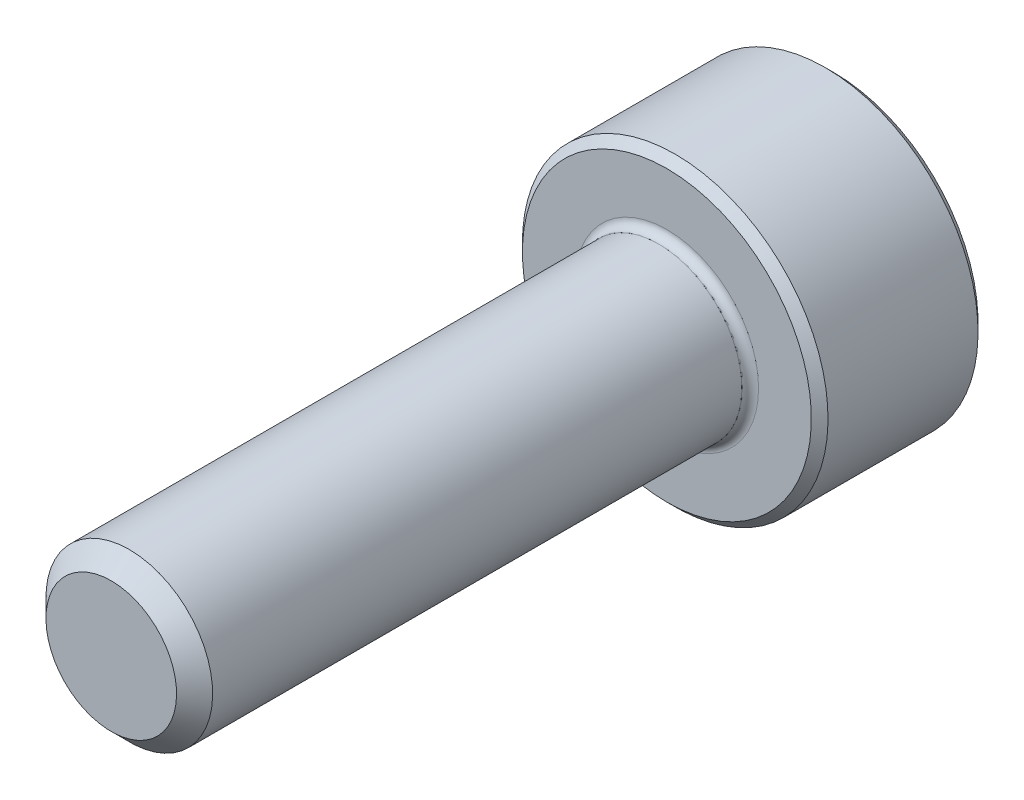
ISO-10303-21;
HEADER;
FILE_DESCRIPTION(('STEP AP214'),'2;1');
FILE_NAME('part.step','',(''),(''),'','','');
FILE_SCHEMA(('AUTOMOTIVE_DESIGN { 1 0 10303 214 1 1 1 1 }'));
ENDSEC;
DATA;
#1=APPLICATION_CONTEXT('core data for automotive mechanical design processes');
#2=APPLICATION_PROTOCOL_DEFINITION('international standard','automotive_design',2000,#1);
#3=PRODUCT_CONTEXT('',#1,'mechanical');
#4=PRODUCT('Part','Part','',(#3));
#5=PRODUCT_RELATED_PRODUCT_CATEGORY('part','',(#4));
#6=PRODUCT_DEFINITION_FORMATION('','',#4);
#7=PRODUCT_DEFINITION_CONTEXT('part definition',#1,'design');
#8=PRODUCT_DEFINITION('design','',#6,#7);
#9=PRODUCT_DEFINITION_SHAPE('','',#8);
#10=(LENGTH_UNIT() NAMED_UNIT(*) SI_UNIT(.MILLI.,.METRE.));
#11=(NAMED_UNIT(*) PLANE_ANGLE_UNIT() SI_UNIT($,.RADIAN.));
#12=(NAMED_UNIT(*) SI_UNIT($,.STERADIAN.) SOLID_ANGLE_UNIT());
#13=UNCERTAINTY_MEASURE_WITH_UNIT(LENGTH_MEASURE(1.E-05),#10,'distance_accuracy_value','');
#14=(GEOMETRIC_REPRESENTATION_CONTEXT(3) GLOBAL_UNCERTAINTY_ASSIGNED_CONTEXT((#13)) GLOBAL_UNIT_ASSIGNED_CONTEXT((#10,
#11,#12)) REPRESENTATION_CONTEXT('',''));
#15=CARTESIAN_POINT('',(0.,0.,0.));
#16=DIRECTION('',(0.,0.,1.));
#17=DIRECTION('',(1.,0.,0.));
#18=AXIS2_PLACEMENT_3D('',#15,#16,#17);
#19=CARTESIAN_POINT('',(0.,0.,-3.5));
#20=DIRECTION('',(0.,0.,-1.));
#21=DIRECTION('',(0.,-1.,0.));
#22=AXIS2_PLACEMENT_3D('',#19,#20,#21);
#23=PLANE('',#22);
#24=CARTESIAN_POINT('',(0.,0.,-3.5));
#25=DIRECTION('',(0.,0.,-1.));
#26=DIRECTION('',(0.,1.,0.));
#27=AXIS2_PLACEMENT_3D('',#24,#25,#26);
#28=CIRCLE('',#27,1.5);
#29=CARTESIAN_POINT('',(0.,1.5,-3.5));
#30=VERTEX_POINT('',#29);
#31=EDGE_CURVE('E12',#30,#30,#28,.T.);
#32=ORIENTED_EDGE('',*,*,#31,.T.);
#33=EDGE_LOOP('',(#32));
#34=FACE_BOUND('',#33,.T.);
#35=ADVANCED_FACE('F47',(#34),#23,.T.);
#36=CARTESIAN_POINT('',(0.,0.,-2.48397459621555));
#37=DIRECTION('',(0.,0.,1.));
#38=DIRECTION('',(0.,1.,0.));
#39=AXIS2_PLACEMENT_3D('',#36,#37,#38);
#40=CYLINDRICAL_SURFACE('',#39,1.5);
#41=ORIENTED_EDGE('',*,*,#31,.F.);
#42=EDGE_LOOP('',(#41));
#43=FACE_BOUND('',#42,.T.);
#44=CARTESIAN_POINT('',(0.,0.,-3.35));
#45=DIRECTION('',(0.,0.,-1.));
#46=DIRECTION('',(0.,1.,0.));
#47=AXIS2_PLACEMENT_3D('',#44,#45,#46);
#48=CIRCLE('',#47,1.5);
#49=CARTESIAN_POINT('',(0.,1.5,-3.35));
#50=VERTEX_POINT('',#49);
#51=EDGE_CURVE('E53',#50,#50,#48,.T.);
#52=ORIENTED_EDGE('',*,*,#51,.T.);
#53=EDGE_LOOP('',(#52));
#54=FACE_BOUND('',#53,.T.);
#55=ADVANCED_FACE('F58',(#43,#54),#40,.T.);
#56=CARTESIAN_POINT('',(0.,0.,-2.48397459621555));
#57=DIRECTION('',(0.,0.,-1.));
#58=DIRECTION('',(0.,-1.,0.));
#59=AXIS2_PLACEMENT_3D('',#56,#57,#58);
#60=CONICAL_SURFACE('',#59,0.,1.04719755119659);
#61=ORIENTED_EDGE('',*,*,#51,.F.);
#62=EDGE_LOOP('',(#61));
#63=FACE_BOUND('',#62,.T.);
#64=CARTESIAN_POINT('',(0.,0.,-2.48397459621555));
#65=VERTEX_POINT('',#64);
#66=VERTEX_LOOP('',#65);
#67=FACE_BOUND('',#66,.T.);
#68=ADVANCED_FACE('F56',(#63,#67),#60,.T.);
#69=CLOSED_SHELL('',(#35,#55,#68));
#70=MANIFOLD_SOLID_BREP('B2',#69);
#71=CARTESIAN_POINT('',(-2.76,-2.75,-3.35));
#72=DIRECTION('',(0.,0.,1.));
#73=DIRECTION('',(-1.,0.,0.));
#74=AXIS2_PLACEMENT_3D('',#71,#72,#73);
#75=PLANE('',#74);
#76=CARTESIAN_POINT('',(0.,0.,-3.35));
#77=DIRECTION('',(0.,0.,-1.));
#78=DIRECTION('',(0.,1.,0.));
#79=AXIS2_PLACEMENT_3D('',#76,#77,#78);
#80=CIRCLE('',#79,1.5);
#81=CARTESIAN_POINT('',(0.,1.5,-3.35));
#82=VERTEX_POINT('',#81);
#83=EDGE_CURVE('E106',#82,#82,#80,.T.);
#84=ORIENTED_EDGE('',*,*,#83,.F.);
#85=EDGE_LOOP('',(#84));
#86=FACE_BOUND('',#85,.T.);
#87=ADVANCED_FACE('F103',(#86),#75,.T.);
#88=CARTESIAN_POINT('',(0.,0.,-3.35));
#89=DIRECTION('',(0.,0.,1.));
#90=DIRECTION('',(0.,1.,0.));
#91=AXIS2_PLACEMENT_3D('',#88,#89,#90);
#92=TOROIDAL_SURFACE('',#91,1.65,0.15);
#93=CARTESIAN_POINT('',(0.,0.,-3.5));
#94=DIRECTION('',(0.,0.,-1.));
#95=DIRECTION('',(0.,1.,0.));
#96=AXIS2_PLACEMENT_3D('',#93,#94,#95);
#97=CIRCLE('',#96,1.65);
#98=CARTESIAN_POINT('',(0.,1.65,-3.5));
#99=VERTEX_POINT('',#98);
#100=EDGE_CURVE('E181',#99,#99,#97,.T.);
#101=ORIENTED_EDGE('',*,*,#100,.F.);
#102=EDGE_LOOP('',(#101));
#103=FACE_BOUND('',#102,.T.);
#104=ORIENTED_EDGE('',*,*,#83,.T.);
#105=EDGE_LOOP('',(#104));
#106=FACE_BOUND('',#105,.T.);
#107=ADVANCED_FACE('F281',(#103,#106),#92,.F.);
#108=CARTESIAN_POINT('',(0.,2.6,-3.5));
#109=DIRECTION('',(0.,0.,1.));
#110=DIRECTION('',(0.,1.,0.));
#111=AXIS2_PLACEMENT_3D('',#108,#109,#110);
#112=PLANE('',#111);
#113=CARTESIAN_POINT('',(0.,0.,-3.5));
#114=DIRECTION('',(0.,0.,-1.));
#115=DIRECTION('',(0.,1.,0.));
#116=AXIS2_PLACEMENT_3D('',#113,#114,#115);
#117=CIRCLE('',#116,2.6);
#118=CARTESIAN_POINT('',(0.,2.6,-3.5));
#119=VERTEX_POINT('',#118);
#120=EDGE_CURVE('E184',#119,#119,#117,.T.);
#121=ORIENTED_EDGE('',*,*,#120,.F.);
#122=EDGE_LOOP('',(#121));
#123=FACE_BOUND('',#122,.T.);
#124=ORIENTED_EDGE('',*,*,#100,.T.);
#125=EDGE_LOOP('',(#124));
#126=FACE_BOUND('',#125,.T.);
#127=ADVANCED_FACE('F278',(#123,#126),#112,.T.);
#128=CARTESIAN_POINT('',(0.,0.,-3.5));
#129=DIRECTION('',(0.,0.,-1.));
#130=DIRECTION('',(0.,-1.,0.));
#131=AXIS2_PLACEMENT_3D('',#128,#129,#130);
#132=CONICAL_SURFACE('',#131,2.6,0.785398163397445);
#133=CARTESIAN_POINT('',(0.,0.,-3.65));
#134=DIRECTION('',(0.,0.,-1.));
#135=DIRECTION('',(0.,1.,0.));
#136=AXIS2_PLACEMENT_3D('',#133,#134,#135);
#137=CIRCLE('',#136,2.75);
#138=CARTESIAN_POINT('',(0.,2.75,-3.65));
#139=VERTEX_POINT('',#138);
#140=EDGE_CURVE('E271',#139,#139,#137,.T.);
#141=ORIENTED_EDGE('',*,*,#140,.F.);
#142=EDGE_LOOP('',(#141));
#143=FACE_BOUND('',#142,.T.);
#144=ORIENTED_EDGE('',*,*,#120,.T.);
#145=EDGE_LOOP('',(#144));
#146=FACE_BOUND('',#145,.T.);
#147=ADVANCED_FACE('F276',(#143,#146),#132,.T.);
#148=CARTESIAN_POINT('',(0.,0.,6.5));
#149=DIRECTION('',(0.,0.,1.));
#150=DIRECTION('',(0.,1.,0.));
#151=AXIS2_PLACEMENT_3D('',#148,#149,#150);
#152=CYLINDRICAL_SURFACE('',#151,2.75);
#153=CARTESIAN_POINT('',(0.,0.,-6.35));
#154=DIRECTION('',(0.,0.,-1.));
#155=DIRECTION('',(0.,1.,0.));
#156=AXIS2_PLACEMENT_3D('',#153,#154,#155);
#157=CIRCLE('',#156,2.75);
#158=CARTESIAN_POINT('',(0.,2.75,-6.35));
#159=VERTEX_POINT('',#158);
#160=EDGE_CURVE('E268',#159,#159,#157,.T.);
#161=ORIENTED_EDGE('',*,*,#160,.F.);
#162=EDGE_LOOP('',(#161));
#163=FACE_BOUND('',#162,.T.);
#164=ORIENTED_EDGE('',*,*,#140,.T.);
#165=EDGE_LOOP('',(#164));
#166=FACE_BOUND('',#165,.T.);
#167=ADVANCED_FACE('F307',(#163,#166),#152,.T.);
#168=CARTESIAN_POINT('',(0.,0.,-6.35));
#169=DIRECTION('',(0.,0.,1.));
#170=DIRECTION('',(0.,1.,0.));
#171=AXIS2_PLACEMENT_3D('',#168,#169,#170);
#172=CONICAL_SURFACE('',#171,2.75,0.785398163397451);
#173=CARTESIAN_POINT('',(0.,0.,-6.5));
#174=DIRECTION('',(0.,0.,-1.));
#175=DIRECTION('',(0.,1.,0.));
#176=AXIS2_PLACEMENT_3D('',#173,#174,#175);
#177=CIRCLE('',#176,2.6);
#178=CARTESIAN_POINT('',(0.,2.6,-6.5));
#179=VERTEX_POINT('',#178);
#180=EDGE_CURVE('E167',#179,#179,#177,.T.);
#181=ORIENTED_EDGE('',*,*,#180,.F.);
#182=EDGE_LOOP('',(#181));
#183=FACE_BOUND('',#182,.T.);
#184=ORIENTED_EDGE('',*,*,#160,.T.);
#185=EDGE_LOOP('',(#184));
#186=FACE_BOUND('',#185,.T.);
#187=ADVANCED_FACE('F315',(#183,#186),#172,.T.);
#188=CARTESIAN_POINT('',(0.,0.,-6.5));
#189=DIRECTION('',(0.,0.,-1.));
#190=DIRECTION('',(0.,-1.,0.));
#191=AXIS2_PLACEMENT_3D('',#188,#189,#190);
#192=PLANE('',#191);
#193=CARTESIAN_POINT('',(0.,0.,-6.5));
#194=DIRECTION('',(0.,0.,1.));
#195=DIRECTION('',(1.,0.,0.));
#196=AXIS2_PLACEMENT_3D('',#193,#194,#195);
#197=CIRCLE('',#196,1.55162884844712);
#198=CARTESIAN_POINT('',(1.55162884844712,0.,-6.5));
#199=VERTEX_POINT('',#198);
#200=EDGE_CURVE('E45',#199,#199,#197,.T.);
#201=ORIENTED_EDGE('',*,*,#200,.T.);
#202=EDGE_LOOP('',(#201));
#203=FACE_BOUND('',#202,.T.);
#204=ORIENTED_EDGE('',*,*,#180,.T.);
#205=EDGE_LOOP('',(#204));
#206=FACE_BOUND('',#205,.T.);
#207=ADVANCED_FACE('F323',(#203,#206),#192,.T.);
#208=CARTESIAN_POINT('',(0.,0.,-6.5));
#209=DIRECTION('',(0.,0.,-1.));
#210=DIRECTION('',(1.,0.,0.));
#211=AXIS2_PLACEMENT_3D('',#208,#209,#210);
#212=CONICAL_SURFACE('',#211,1.55162884844712,0.78539816339745);
#213=ORIENTED_EDGE('',*,*,#200,.F.);
#214=EDGE_LOOP('',(#213));
#215=FACE_BOUND('',#214,.T.);
#216=CARTESIAN_POINT('',(-0.000199999999999347,-1.4434911430279,-6.39186230843608));
#217=CARTESIAN_POINT('',(0.0427751670715874,-1.41867941875065,-6.36706849258205));
#218=CARTESIAN_POINT('',(0.0864690047459488,-1.39345276980743,-6.34373055894563));
#219=CARTESIAN_POINT('',(0.175565930841943,-1.34201263554194,-6.30099882861148));
#220=CARTESIAN_POINT('',(0.220977498357065,-1.31579425481276,-6.28162881688736));
#221=CARTESIAN_POINT('',(0.312547820935261,-1.26292610442246,-6.24844730794042));
#222=CARTESIAN_POINT('',(0.358683240175886,-1.23628980770471,-6.2345523835796));
#223=CARTESIAN_POINT('',(0.451970080407593,-1.18243062538508,-6.21314410668758));
#224=CARTESIAN_POINT('',(0.499118649136381,-1.15520938653761,-6.20561476609373));
#225=CARTESIAN_POINT('',(0.580373556887253,-1.10829684367467,-6.19882132257765));
#226=CARTESIAN_POINT('',(0.614374876627942,-1.08866617256958,-6.1978153836313));
#227=CARTESIAN_POINT('',(0.682317764432479,-1.04943932800611,-6.19950823943826));
#228=CARTESIAN_POINT('',(0.716259317655659,-1.02984316311599,-6.20220785174248));
#229=CARTESIAN_POINT('',(0.783814856457501,-0.990839954603499,-6.21115575484332));
#230=CARTESIAN_POINT('',(0.817428507286776,-0.971433104248771,-6.21740735042665));
#231=CARTESIAN_POINT('',(0.884094638217814,-0.932943395609905,-6.23312250594085));
#232=CARTESIAN_POINT('',(0.917146871030297,-0.9138606800983,-6.2425874446144));
#233=CARTESIAN_POINT('',(1.00179969160027,-0.864986351354567,-6.27067821521453));
#234=CARTESIAN_POINT('',(1.05286649242964,-0.835502920149075,-6.29141698197915));
#235=CARTESIAN_POINT('',(1.15300085411326,-0.777690319475908,-6.33813395919842));
#236=CARTESIAN_POINT('',(1.20207431157827,-0.749357745598417,-6.36409512047371));
#237=CARTESIAN_POINT('',(1.2502,-0.721572366433194,-6.39186230843608));
#238=B_SPLINE_CURVE_WITH_KNOTS('',3,(#216,#217,#218,#219,#220,#221,#222,#223,#224,#225,#226,
#227,#228,#229,#230,#231,#232,#233,#234,#235,#236,#237),.UNSPECIFIED.,.F.,.F.,(4,2,2,2,2,2,2,2,
2,2,4),(0.,0.166533409618304,0.334037607289762,0.498880396489698,0.663307919240275,
0.780963963458827,0.898645970148454,1.01643764860773,1.1342799317155,1.32148652032141,
1.50809158792573),.UNSPECIFIED.);
#239=CARTESIAN_POINT('',(0.,-1.44337567297406,-6.39174682452695));
#240=VERTEX_POINT('',#239);
#241=CARTESIAN_POINT('',(1.25,-0.721687836487032,-6.39174682452694));
#242=VERTEX_POINT('',#241);
#243=EDGE_CURVE('E161',#240,#242,#238,.T.);
#244=ORIENTED_EDGE('',*,*,#243,.T.);
#245=CARTESIAN_POINT('',(1.25,-1.52022146239345,-6.91651070319084));
#246=CARTESIAN_POINT('',(1.25,-1.48354689134962,-6.88818689718723));
#247=CARTESIAN_POINT('',(1.25,-1.44667707589305,-6.86011672093047));
#248=CARTESIAN_POINT('',(1.25,-1.37246477804769,-6.80459065501776));
#249=CARTESIAN_POINT('',(1.25,-1.33512218721453,-6.77713491044787));
#250=CARTESIAN_POINT('',(1.25,-1.22171630832114,-6.69545809771049));
#251=CARTESIAN_POINT('',(1.25,-1.14482995781092,-6.6423614251193));
#252=CARTESIAN_POINT('',(1.25,-0.983056768942587,-6.53734973416941));
#253=CARTESIAN_POINT('',(1.25,-0.897974111811057,-6.48573326925832));
#254=CARTESIAN_POINT('',(1.25,-0.723462355215556,-6.39078355108508));
#255=CARTESIAN_POINT('',(1.25,-0.634049271919706,-6.34742232185916));
#256=CARTESIAN_POINT('',(1.25,-0.500588771143699,-6.29435177040724));
#257=CARTESIAN_POINT('',(1.25,-0.45869172620811,-6.27926501327173));
#258=CARTESIAN_POINT('',(1.25,-0.373815329706778,-6.25244749770266));
#259=CARTESIAN_POINT('',(1.25,-0.330835910419723,-6.24071694982871));
#260=CARTESIAN_POINT('',(1.25,-0.244810833071148,-6.22144313304601));
#261=CARTESIAN_POINT('',(1.25,-0.20178270746757,-6.21382289169453));
#262=CARTESIAN_POINT('',(1.25,-0.115176247984995,-6.20293190707962));
#263=CARTESIAN_POINT('',(1.25,-0.0715980347745598,-6.1996602260857));
#264=CARTESIAN_POINT('',(1.25,0.0136806197531965,-6.19775210045869));
#265=CARTESIAN_POINT('',(1.25,0.0553765370047047,-6.19891205716704));
#266=CARTESIAN_POINT('',(1.25,0.13844909645316,-6.20533266388464));
#267=CARTESIAN_POINT('',(1.25,0.179825709781942,-6.21059368038276));
#268=CARTESIAN_POINT('',(1.25,0.262662840763599,-6.22500574721218));
#269=CARTESIAN_POINT('',(1.25,0.304111120669651,-6.23422600730023));
#270=CARTESIAN_POINT('',(1.25,0.386089884230835,-6.25604235623938));
#271=CARTESIAN_POINT('',(1.25,0.426620414510369,-6.26863827317792));
#272=CARTESIAN_POINT('',(1.25,0.550794781768362,-6.31205959164791));
#273=CARTESIAN_POINT('',(1.25,0.632755591043412,-6.34768282700966));
#274=CARTESIAN_POINT('',(1.25,0.792852508946383,-6.42696814455953));
#275=CARTESIAN_POINT('',(1.25,0.870973935410876,-6.47065844211049));
#276=CARTESIAN_POINT('',(1.25,1.02031328199646,-6.56088158787621));
#277=CARTESIAN_POINT('',(1.25,1.09168171050215,-6.60716845879521));
#278=CARTESIAN_POINT('',(1.25,1.19682802849918,-6.67876149953674));
#279=CARTESIAN_POINT('',(1.25,1.2314248214359,-6.70288582787532));
#280=CARTESIAN_POINT('',(1.25,1.30014350643268,-6.75178258410313));
#281=CARTESIAN_POINT('',(1.25,1.33426552680451,-6.7765548314612));
#282=CARTESIAN_POINT('',(1.25,1.36818950249276,-6.8015960474388));
#283=B_SPLINE_CURVE_WITH_KNOTS('',3,(#245,#246,#247,#248,#249,#250,#251,#252,#253,#254,#255,
#256,#257,#258,#259,#260,#261,#262,#263,#264,#265,#266,#267,#268,#269,#270,#271,#272,#273,#274,
#275,#276,#277,#278,#279,#280,#281,#282),.UNSPECIFIED.,.F.,.F.,(4,2,2,2,2,2,2,2,2,2,2,2,2,2,2,2,
2,2,4),(0.,0.139012369615044,0.278057225136918,0.558259504053771,0.856585057342474,
1.15388088887299,1.28736138903992,1.42085026158167,1.55174393609413,1.68260937990424,
1.80753647715252,1.93247473971975,2.05969207441603,2.18690293152764,2.45422704655832,
2.72250450232039,2.97756898823762,3.10409578574714,3.23058769667827),.UNSPECIFIED.);
#284=CARTESIAN_POINT('',(1.25,0.721687836487032,-6.39174682452694));
#285=VERTEX_POINT('',#284);
#286=EDGE_CURVE('E170',#242,#285,#283,.T.);
#287=ORIENTED_EDGE('',*,*,#286,.T.);
#288=CARTESIAN_POINT('',(1.2502,0.721572366433194,-6.39186230843608));
#289=CARTESIAN_POINT('',(1.20722483292841,0.746384090710444,-6.36706849258205));
#290=CARTESIAN_POINT('',(1.16353099525405,0.771610739653664,-6.34373055894563));
#291=CARTESIAN_POINT('',(1.07443406915806,0.823050873919154,-6.30099882861148));
#292=CARTESIAN_POINT('',(1.02902250164294,0.849269254648333,-6.28162881688736));
#293=CARTESIAN_POINT('',(0.93745217906474,0.902137405038635,-6.24844730794042));
#294=CARTESIAN_POINT('',(0.891316759824114,0.928773701756387,-6.2345523835796));
#295=CARTESIAN_POINT('',(0.798029919592408,0.982632884076012,-6.21314410668758));
#296=CARTESIAN_POINT('',(0.750881350863621,1.00985412292348,-6.20561476609373));
#297=CARTESIAN_POINT('',(0.669626443112748,1.05676666578643,-6.19882132257765));
#298=CARTESIAN_POINT('',(0.635625123372059,1.07639733689152,-6.19781538363129));
#299=CARTESIAN_POINT('',(0.567682235567523,1.11562418145499,-6.19950823943826));
#300=CARTESIAN_POINT('',(0.533740682344343,1.1352203463451,-6.20220785174248));
#301=CARTESIAN_POINT('',(0.466185143542501,1.1742235548576,-6.21115575484332));
#302=CARTESIAN_POINT('',(0.432571492713226,1.19363040521233,-6.21740735042665));
#303=CARTESIAN_POINT('',(0.365905361782187,1.23212011385119,-6.23312250594085));
#304=CARTESIAN_POINT('',(0.332853128969705,1.2512028293628,-6.2425874446144));
#305=CARTESIAN_POINT('',(0.248200308399736,1.30007715810653,-6.27067821521453));
#306=CARTESIAN_POINT('',(0.197133507570362,1.32956058931202,-6.29141698197915));
#307=CARTESIAN_POINT('',(0.0969991458867456,1.38737318998519,-6.33813395919842));
#308=CARTESIAN_POINT('',(0.0479256884217306,1.41570576386268,-6.36409512047371));
#309=CARTESIAN_POINT('',(-0.000200000000000208,1.4434911430279,-6.39186230843608));
#310=B_SPLINE_CURVE_WITH_KNOTS('',3,(#288,#289,#290,#291,#292,#293,#294,#295,#296,#297,#298,
#299,#300,#301,#302,#303,#304,#305,#306,#307,#308,#309),.UNSPECIFIED.,.F.,.F.,(4,2,2,2,2,2,2,2,
2,2,4),(0.,0.166533409618303,0.334037607289761,0.498880396489698,0.663307919240274,
0.780963963458826,0.898645970148452,1.01643764860773,1.13427993171549,1.32148652032141,
1.50809158792574),.UNSPECIFIED.);
#311=CARTESIAN_POINT('',(0.,1.44337567297406,-6.39174682452694));
#312=VERTEX_POINT('',#311);
#313=EDGE_CURVE('E176',#285,#312,#310,.T.);
#314=ORIENTED_EDGE('',*,*,#313,.T.);
#315=CARTESIAN_POINT('',(0.000199999999999644,1.4434911430279,-6.39186230843608));
#316=CARTESIAN_POINT('',(-0.0427751670715868,1.41867941875065,-6.36706849258205));
#317=CARTESIAN_POINT('',(-0.0864690047459481,1.39345276980743,-6.34373055894563));
#318=CARTESIAN_POINT('',(-0.175565930841942,1.34201263554194,-6.30099882861148));
#319=CARTESIAN_POINT('',(-0.220977498357064,1.31579425481276,-6.28162881688736));
#320=CARTESIAN_POINT('',(-0.312547820935259,1.26292610442246,-6.24844730794042));
#321=CARTESIAN_POINT('',(-0.358683240175885,1.23628980770471,-6.2345523835796));
#322=CARTESIAN_POINT('',(-0.451970080407592,1.18243062538508,-6.21314410668758));
#323=CARTESIAN_POINT('',(-0.49911864913638,1.15520938653761,-6.20561476609373));
#324=CARTESIAN_POINT('',(-0.580373556887252,1.10829684367467,-6.19882132257765));
#325=CARTESIAN_POINT('',(-0.614374876627941,1.08866617256958,-6.1978153836313));
#326=CARTESIAN_POINT('',(-0.682317764432477,1.04943932800611,-6.19950823943826));
#327=CARTESIAN_POINT('',(-0.716259317655657,1.02984316311599,-6.20220785174248));
#328=CARTESIAN_POINT('',(-0.783814856457499,0.990839954603499,-6.21115575484332));
#329=CARTESIAN_POINT('',(-0.817428507286774,0.971433104248771,-6.21740735042665));
#330=CARTESIAN_POINT('',(-0.884094638217813,0.932943395609905,-6.23312250594085));
#331=CARTESIAN_POINT('',(-0.917146871030295,0.9138606800983,-6.2425874446144));
#332=CARTESIAN_POINT('',(-1.00179969160026,0.864986351354567,-6.27067821521453));
#333=CARTESIAN_POINT('',(-1.05286649242964,0.835502920149075,-6.29141698197915));
#334=CARTESIAN_POINT('',(-1.15300085411325,0.777690319475908,-6.33813395919842));
#335=CARTESIAN_POINT('',(-1.20207431157827,0.749357745598416,-6.36409512047371));
#336=CARTESIAN_POINT('',(-1.2502,0.721572366433194,-6.39186230843608));
#337=B_SPLINE_CURVE_WITH_KNOTS('',3,(#315,#316,#317,#318,#319,#320,#321,#322,#323,#324,#325,
#326,#327,#328,#329,#330,#331,#332,#333,#334,#335,#336),.UNSPECIFIED.,.F.,.F.,(4,2,2,2,2,2,2,2,
2,2,4),(0.,0.166533409618303,0.334037607289761,0.498880396489697,0.663307919240274,
0.780963963458826,0.898645970148452,1.01643764860773,1.13427993171549,1.32148652032141,
1.50809158792574),.UNSPECIFIED.);
#338=CARTESIAN_POINT('',(-1.25,0.721687836487032,-6.39174682452694));
#339=VERTEX_POINT('',#338);
#340=EDGE_CURVE('E217',#312,#339,#337,.T.);
#341=ORIENTED_EDGE('',*,*,#340,.T.);
#342=CARTESIAN_POINT('',(-1.25,-1.52022146239345,-6.91651070319084));
#343=CARTESIAN_POINT('',(-1.25,-1.48354689134962,-6.88818689718723));
#344=CARTESIAN_POINT('',(-1.25,-1.44667707589305,-6.86011672093047));
#345=CARTESIAN_POINT('',(-1.25,-1.37246477804769,-6.80459065501776));
#346=CARTESIAN_POINT('',(-1.25,-1.33512218721453,-6.77713491044787));
#347=CARTESIAN_POINT('',(-1.25,-1.22171630832114,-6.69545809771049));
#348=CARTESIAN_POINT('',(-1.25,-1.14482995781092,-6.6423614251193));
#349=CARTESIAN_POINT('',(-1.25,-0.983056768942587,-6.53734973416941));
#350=CARTESIAN_POINT('',(-1.25,-0.897974111811057,-6.48573326925832));
#351=CARTESIAN_POINT('',(-1.25,-0.723462355215556,-6.39078355108508));
#352=CARTESIAN_POINT('',(-1.25,-0.634049271919706,-6.34742232185916));
#353=CARTESIAN_POINT('',(-1.25,-0.5005887711437,-6.29435177040724));
#354=CARTESIAN_POINT('',(-1.25,-0.45869172620811,-6.27926501327173));
#355=CARTESIAN_POINT('',(-1.25,-0.373815329706779,-6.25244749770266));
#356=CARTESIAN_POINT('',(-1.25,-0.330835910419723,-6.24071694982871));
#357=CARTESIAN_POINT('',(-1.25,-0.244810833071148,-6.22144313304601));
#358=CARTESIAN_POINT('',(-1.25,-0.20178270746757,-6.21382289169453));
#359=CARTESIAN_POINT('',(-1.25,-0.115176247984995,-6.20293190707962));
#360=CARTESIAN_POINT('',(-1.25,-0.0715980347745597,-6.1996602260857));
#361=CARTESIAN_POINT('',(-1.25,0.0136806197531966,-6.19775210045869));
#362=CARTESIAN_POINT('',(-1.25,0.0553765370047047,-6.19891205716704));
#363=CARTESIAN_POINT('',(-1.25,0.13844909645316,-6.20533266388464));
#364=CARTESIAN_POINT('',(-1.25,0.179825709781942,-6.21059368038276));
#365=CARTESIAN_POINT('',(-1.25,0.262662840763598,-6.22500574721218));
#366=CARTESIAN_POINT('',(-1.25,0.304111120669651,-6.23422600730023));
#367=CARTESIAN_POINT('',(-1.25,0.386089884230834,-6.25604235623938));
#368=CARTESIAN_POINT('',(-1.25,0.426620414510369,-6.26863827317792));
#369=CARTESIAN_POINT('',(-1.25,0.550794781768362,-6.3120595916479));
#370=CARTESIAN_POINT('',(-1.25,0.632755591043412,-6.34768282700966));
#371=CARTESIAN_POINT('',(-1.25,0.792852508946382,-6.42696814455953));
#372=CARTESIAN_POINT('',(-1.25,0.870973935410876,-6.47065844211049));
#373=CARTESIAN_POINT('',(-1.25,1.02031328199646,-6.56088158787621));
#374=CARTESIAN_POINT('',(-1.25,1.09168171050215,-6.60716845879521));
#375=CARTESIAN_POINT('',(-1.25,1.19682802849918,-6.67876149953674));
#376=CARTESIAN_POINT('',(-1.25,1.2314248214359,-6.70288582787532));
#377=CARTESIAN_POINT('',(-1.25,1.30014350643268,-6.75178258410313));
#378=CARTESIAN_POINT('',(-1.25,1.33426552680451,-6.7765548314612));
#379=CARTESIAN_POINT('',(-1.25,1.36818950249276,-6.8015960474388));
#380=B_SPLINE_CURVE_WITH_KNOTS('',3,(#342,#343,#344,#345,#346,#347,#348,#349,#350,#351,#352,
#353,#354,#355,#356,#357,#358,#359,#360,#361,#362,#363,#364,#365,#366,#367,#368,#369,#370,#371,
#372,#373,#374,#375,#376,#377,#378,#379),.UNSPECIFIED.,.F.,.F.,(4,2,2,2,2,2,2,2,2,2,2,2,2,2,2,2,
2,2,4),(0.,0.139012369615044,0.278057225136918,0.558259504053771,0.856585057342475,
1.15388088887299,1.28736138903992,1.42085026158167,1.55174393609413,1.68260937990424,
1.80753647715252,1.93247473971975,2.05969207441603,2.18690293152764,2.45422704655832,
2.72250450232039,2.97756898823762,3.10409578574714,3.23058769667827),.UNSPECIFIED.);
#381=CARTESIAN_POINT('',(-1.25,-0.721687836487032,-6.39174682452694));
#382=VERTEX_POINT('',#381);
#383=EDGE_CURVE('E211',#339,#382,#380,.F.);
#384=ORIENTED_EDGE('',*,*,#383,.T.);
#385=CARTESIAN_POINT('',(-1.2502,-0.721572366433195,-6.39186230843608));
#386=CARTESIAN_POINT('',(-1.20722483292841,-0.746384090710444,-6.36706849258205));
#387=CARTESIAN_POINT('',(-1.16353099525405,-0.771610739653664,-6.34373055894563));
#388=CARTESIAN_POINT('',(-1.07443406915806,-0.823050873919155,-6.30099882861148));
#389=CARTESIAN_POINT('',(-1.02902250164294,-0.849269254648333,-6.28162881688736));
#390=CARTESIAN_POINT('',(-0.93745217906474,-0.902137405038635,-6.24844730794042));
#391=CARTESIAN_POINT('',(-0.891316759824114,-0.928773701756387,-6.2345523835796));
#392=CARTESIAN_POINT('',(-0.798029919592408,-0.982632884076012,-6.21314410668758));
#393=CARTESIAN_POINT('',(-0.75088135086362,-1.00985412292348,-6.20561476609373));
#394=CARTESIAN_POINT('',(-0.669626443112748,-1.05676666578643,-6.19882132257765));
#395=CARTESIAN_POINT('',(-0.635625123372059,-1.07639733689152,-6.1978153836313));
#396=CARTESIAN_POINT('',(-0.567682235567523,-1.11562418145499,-6.19950823943826));
#397=CARTESIAN_POINT('',(-0.533740682344343,-1.1352203463451,-6.20220785174248));
#398=CARTESIAN_POINT('',(-0.466185143542501,-1.1742235548576,-6.21115575484332));
#399=CARTESIAN_POINT('',(-0.432571492713225,-1.19363040521233,-6.21740735042665));
#400=CARTESIAN_POINT('',(-0.365905361782187,-1.23212011385119,-6.23312250594085));
#401=CARTESIAN_POINT('',(-0.332853128969705,-1.2512028293628,-6.2425874446144));
#402=CARTESIAN_POINT('',(-0.248200308399736,-1.30007715810653,-6.27067821521453));
#403=CARTESIAN_POINT('',(-0.197133507570362,-1.32956058931202,-6.29141698197915));
#404=CARTESIAN_POINT('',(-0.0969991458867446,-1.38737318998519,-6.33813395919842));
#405=CARTESIAN_POINT('',(-0.0479256884217298,-1.41570576386268,-6.36409512047371));
#406=CARTESIAN_POINT('',(0.000200000000000719,-1.4434911430279,-6.39186230843608));
#407=B_SPLINE_CURVE_WITH_KNOTS('',3,(#385,#386,#387,#388,#389,#390,#391,#392,#393,#394,#395,
#396,#397,#398,#399,#400,#401,#402,#403,#404,#405,#406),.UNSPECIFIED.,.F.,.F.,(4,2,2,2,2,2,2,2,
2,2,4),(0.,0.166533409618303,0.334037607289761,0.498880396489698,0.663307919240274,
0.780963963458826,0.898645970148452,1.01643764860773,1.13427993171549,1.32148652032141,
1.50809158792574),.UNSPECIFIED.);
#408=EDGE_CURVE('E111',#382,#240,#407,.T.);
#409=ORIENTED_EDGE('',*,*,#408,.T.);
#410=EDGE_LOOP('',(#244,#287,#314,#341,#384,#409));
#411=FACE_BOUND('',#410,.T.);
#412=ADVANCED_FACE('F179',(#215,#411),#212,.F.);
#413=CARTESIAN_POINT('',(0.,2.6,-4.5));
#414=DIRECTION('',(0.,0.,1.));
#415=DIRECTION('',(0.,1.,0.));
#416=AXIS2_PLACEMENT_3D('',#413,#414,#415);
#417=PLANE('',#416);
#418=DIRECTION('',(0.866025403784438,0.5,0.));
#419=VECTOR('',#418,1.);
#420=CARTESIAN_POINT('',(0.,-1.44337567297406,-4.5));
#421=LINE('',#420,#419);
#422=CARTESIAN_POINT('',(0.,-1.44337567297406,-4.5));
#423=VERTEX_POINT('',#422);
#424=CARTESIAN_POINT('',(1.25,-0.721687836487032,-4.5));
#425=VERTEX_POINT('',#424);
#426=EDGE_CURVE('E163',#423,#425,#421,.T.);
#427=ORIENTED_EDGE('',*,*,#426,.F.);
#428=DIRECTION('',(0.866025403784439,-0.5,0.));
#429=VECTOR('',#428,1.);
#430=CARTESIAN_POINT('',(-1.25,-0.721687836487032,-4.5));
#431=LINE('',#430,#429);
#432=CARTESIAN_POINT('',(-1.25,-0.721687836487033,-4.5));
#433=VERTEX_POINT('',#432);
#434=EDGE_CURVE('E249',#433,#423,#431,.T.);
#435=ORIENTED_EDGE('',*,*,#434,.F.);
#436=DIRECTION('',(0.,-1.,0.));
#437=VECTOR('',#436,1.);
#438=CARTESIAN_POINT('',(-1.25,0.721687836487032,-4.5));
#439=LINE('',#438,#437);
#440=CARTESIAN_POINT('',(-1.25,0.721687836487032,-4.5));
#441=VERTEX_POINT('',#440);
#442=EDGE_CURVE('E251',#441,#433,#439,.T.);
#443=ORIENTED_EDGE('',*,*,#442,.F.);
#444=DIRECTION('',(-0.866025403784439,-0.5,0.));
#445=VECTOR('',#444,1.);
#446=CARTESIAN_POINT('',(0.,1.44337567297406,-4.5));
#447=LINE('',#446,#445);
#448=CARTESIAN_POINT('',(0.,1.44337567297406,-4.5));
#449=VERTEX_POINT('',#448);
#450=EDGE_CURVE('E254',#449,#441,#447,.T.);
#451=ORIENTED_EDGE('',*,*,#450,.F.);
#452=DIRECTION('',(-0.866025403784439,0.5,0.));
#453=VECTOR('',#452,1.);
#454=CARTESIAN_POINT('',(1.25,0.721687836487032,-4.5));
#455=LINE('',#454,#453);
#456=CARTESIAN_POINT('',(1.25,0.721687836487032,-4.5));
#457=VERTEX_POINT('',#456);
#458=EDGE_CURVE('E258',#457,#449,#455,.T.);
#459=ORIENTED_EDGE('',*,*,#458,.F.);
#460=DIRECTION('',(0.,1.,0.));
#461=VECTOR('',#460,1.);
#462=CARTESIAN_POINT('',(1.25,-0.721687836487032,-4.5));
#463=LINE('',#462,#461);
#464=EDGE_CURVE('E177',#425,#457,#463,.T.);
#465=ORIENTED_EDGE('',*,*,#464,.F.);
#466=EDGE_LOOP('',(#427,#435,#443,#451,#459,#465));
#467=FACE_BOUND('',#466,.T.);
#468=ADVANCED_FACE('F198',(#467),#417,.F.);
#469=CARTESIAN_POINT('',(0.,-1.44337567297406,0.318813079129867));
#470=DIRECTION('',(0.5,-0.866025403784438,0.));
#471=DIRECTION('',(0.866025403784438,0.5,0.));
#472=AXIS2_PLACEMENT_3D('',#469,#470,#471);
#473=PLANE('',#472);
#474=DIRECTION('',(0.,0.,-1.));
#475=VECTOR('',#474,1.);
#476=CARTESIAN_POINT('',(0.,-1.44337567297406,0.318813079129867));
#477=LINE('',#476,#475);
#478=EDGE_CURVE('E118',#423,#240,#477,.T.);
#479=ORIENTED_EDGE('',*,*,#478,.F.);
#480=ORIENTED_EDGE('',*,*,#426,.T.);
#481=DIRECTION('',(0.,0.,-1.));
#482=VECTOR('',#481,1.);
#483=CARTESIAN_POINT('',(1.25,-0.721687836487032,0.318813079129867));
#484=LINE('',#483,#482);
#485=EDGE_CURVE('E157',#425,#242,#484,.T.);
#486=ORIENTED_EDGE('',*,*,#485,.T.);
#487=ORIENTED_EDGE('',*,*,#243,.F.);
#488=EDGE_LOOP('',(#479,#480,#486,#487));
#489=FACE_BOUND('',#488,.T.);
#490=ADVANCED_FACE('F159',(#489),#473,.F.);
#491=CARTESIAN_POINT('',(-1.25,-0.721687836487032,0.318813079129867));
#492=DIRECTION('',(-0.5,-0.866025403784439,0.));
#493=DIRECTION('',(0.866025403784439,-0.5,0.));
#494=AXIS2_PLACEMENT_3D('',#491,#492,#493);
#495=PLANE('',#494);
#496=DIRECTION('',(0.,0.,-1.));
#497=VECTOR('',#496,1.);
#498=CARTESIAN_POINT('',(-1.25,-0.721687836487032,0.318813079129867));
#499=LINE('',#498,#497);
#500=EDGE_CURVE('E126',#433,#382,#499,.T.);
#501=ORIENTED_EDGE('',*,*,#500,.F.);
#502=ORIENTED_EDGE('',*,*,#434,.T.);
#503=ORIENTED_EDGE('',*,*,#478,.T.);
#504=ORIENTED_EDGE('',*,*,#408,.F.);
#505=EDGE_LOOP('',(#501,#502,#503,#504));
#506=FACE_BOUND('',#505,.T.);
#507=ADVANCED_FACE('F197',(#506),#495,.F.);
#508=CARTESIAN_POINT('',(-1.25,0.721687836487032,0.318813079129867));
#509=DIRECTION('',(-1.,0.,0.));
#510=DIRECTION('',(0.,0.,-1.));
#511=AXIS2_PLACEMENT_3D('',#508,#509,#510);
#512=PLANE('',#511);
#513=DIRECTION('',(0.,0.,-1.));
#514=VECTOR('',#513,1.);
#515=CARTESIAN_POINT('',(-1.25,0.721687836487032,0.318813079129867));
#516=LINE('',#515,#514);
#517=EDGE_CURVE('E253',#441,#339,#516,.T.);
#518=ORIENTED_EDGE('',*,*,#517,.F.);
#519=ORIENTED_EDGE('',*,*,#442,.T.);
#520=ORIENTED_EDGE('',*,*,#500,.T.);
#521=ORIENTED_EDGE('',*,*,#383,.F.);
#522=EDGE_LOOP('',(#518,#519,#520,#521));
#523=FACE_BOUND('',#522,.T.);
#524=ADVANCED_FACE('F202',(#523),#512,.F.);
#525=CARTESIAN_POINT('',(0.,1.44337567297406,0.318813079129867));
#526=DIRECTION('',(-0.5,0.866025403784438,0.));
#527=DIRECTION('',(-0.866025403784439,-0.5,0.));
#528=AXIS2_PLACEMENT_3D('',#525,#526,#527);
#529=PLANE('',#528);
#530=DIRECTION('',(0.,0.,-1.));
#531=VECTOR('',#530,1.);
#532=CARTESIAN_POINT('',(0.,1.44337567297406,0.318813079129867));
#533=LINE('',#532,#531);
#534=EDGE_CURVE('E257',#449,#312,#533,.T.);
#535=ORIENTED_EDGE('',*,*,#534,.F.);
#536=ORIENTED_EDGE('',*,*,#450,.T.);
#537=ORIENTED_EDGE('',*,*,#517,.T.);
#538=ORIENTED_EDGE('',*,*,#340,.F.);
#539=EDGE_LOOP('',(#535,#536,#537,#538));
#540=FACE_BOUND('',#539,.T.);
#541=ADVANCED_FACE('F229',(#540),#529,.F.);
#542=CARTESIAN_POINT('',(1.25,0.721687836487032,0.318813079129867));
#543=DIRECTION('',(0.5,0.866025403784439,0.));
#544=DIRECTION('',(-0.866025403784439,0.5,0.));
#545=AXIS2_PLACEMENT_3D('',#542,#543,#544);
#546=PLANE('',#545);
#547=DIRECTION('',(0.,0.,-1.));
#548=VECTOR('',#547,1.);
#549=CARTESIAN_POINT('',(1.25,0.721687836487032,0.318813079129867));
#550=LINE('',#549,#548);
#551=EDGE_CURVE('E172',#457,#285,#550,.T.);
#552=ORIENTED_EDGE('',*,*,#551,.F.);
#553=ORIENTED_EDGE('',*,*,#458,.T.);
#554=ORIENTED_EDGE('',*,*,#534,.T.);
#555=ORIENTED_EDGE('',*,*,#313,.F.);
#556=EDGE_LOOP('',(#552,#553,#554,#555));
#557=FACE_BOUND('',#556,.T.);
#558=ADVANCED_FACE('F232',(#557),#546,.F.);
#559=CARTESIAN_POINT('',(1.25,-0.721687836487032,0.318813079129867));
#560=DIRECTION('',(1.,0.,0.));
#561=DIRECTION('',(0.,0.,1.));
#562=AXIS2_PLACEMENT_3D('',#559,#560,#561);
#563=PLANE('',#562);
#564=ORIENTED_EDGE('',*,*,#485,.F.);
#565=ORIENTED_EDGE('',*,*,#464,.T.);
#566=ORIENTED_EDGE('',*,*,#551,.T.);
#567=ORIENTED_EDGE('',*,*,#286,.F.);
#568=EDGE_LOOP('',(#564,#565,#566,#567));
#569=FACE_BOUND('',#568,.T.);
#570=ADVANCED_FACE('F171',(#569),#563,.F.);
#571=CLOSED_SHELL('',(#87,#107,#127,#147,#167,#187,#207,#412,#468,#490,#507,#524,#541,#558,#570));
#572=MANIFOLD_SOLID_BREP('B6',#571);
#573=CARTESIAN_POINT('',(-2.76,-2.75,-3.35));
#574=DIRECTION('',(0.,0.,1.));
#575=DIRECTION('',(-1.,0.,0.));
#576=AXIS2_PLACEMENT_3D('',#573,#574,#575);
#577=PLANE('',#576);
#578=CARTESIAN_POINT('',(0.,0.,-3.35));
#579=DIRECTION('',(0.,0.,-1.));
#580=DIRECTION('',(0.,1.,0.));
#581=AXIS2_PLACEMENT_3D('',#578,#579,#580);
#582=CIRCLE('',#581,1.5);
#583=CARTESIAN_POINT('',(0.,1.5,-3.35));
#584=VERTEX_POINT('',#583);
#585=EDGE_CURVE('E458',#584,#584,#582,.T.);
#586=ORIENTED_EDGE('',*,*,#585,.T.);
#587=EDGE_LOOP('',(#586));
#588=FACE_BOUND('',#587,.T.);
#589=ADVANCED_FACE('F448',(#588),#577,.F.);
#590=CARTESIAN_POINT('',(0.,1.17524047358084,6.5));
#591=DIRECTION('',(0.,0.,1.));
#592=DIRECTION('',(0.,1.,0.));
#593=AXIS2_PLACEMENT_3D('',#590,#591,#592);
#594=PLANE('',#593);
#595=CARTESIAN_POINT('',(0.,0.,6.5));
#596=DIRECTION('',(0.,0.,-1.));
#597=DIRECTION('',(0.,1.,0.));
#598=AXIS2_PLACEMENT_3D('',#595,#596,#597);
#599=CIRCLE('',#598,1.17524047358084);
#600=CARTESIAN_POINT('',(0.,1.17524047358084,6.5));
#601=VERTEX_POINT('',#600);
#602=EDGE_CURVE('E102',#601,#601,#599,.T.);
#603=ORIENTED_EDGE('',*,*,#602,.F.);
#604=EDGE_LOOP('',(#603));
#605=FACE_BOUND('',#604,.T.);
#606=ADVANCED_FACE('F473',(#605),#594,.T.);
#607=CARTESIAN_POINT('',(0.,0.,6.5));
#608=DIRECTION('',(0.,0.,-1.));
#609=DIRECTION('',(0.,-1.,0.));
#610=AXIS2_PLACEMENT_3D('',#607,#608,#609);
#611=CONICAL_SURFACE('',#610,1.17524047358084,0.785398163397444);
#612=CARTESIAN_POINT('',(0.,0.,6.17524047358083));
#613=DIRECTION('',(0.,0.,-1.));
#614=DIRECTION('',(0.,1.,0.));
#615=AXIS2_PLACEMENT_3D('',#612,#613,#614);
#616=CIRCLE('',#615,1.5);
#617=CARTESIAN_POINT('',(0.,1.5,6.17524047358083));
#618=VERTEX_POINT('',#617);
#619=EDGE_CURVE('E454',#618,#618,#616,.T.);
#620=ORIENTED_EDGE('',*,*,#619,.F.);
#621=EDGE_LOOP('',(#620));
#622=FACE_BOUND('',#621,.T.);
#623=ORIENTED_EDGE('',*,*,#602,.T.);
#624=EDGE_LOOP('',(#623));
#625=FACE_BOUND('',#624,.T.);
#626=ADVANCED_FACE('F468',(#622,#625),#611,.T.);
#627=CARTESIAN_POINT('',(0.,0.,6.5));
#628=DIRECTION('',(0.,0.,1.));
#629=DIRECTION('',(0.,1.,0.));
#630=AXIS2_PLACEMENT_3D('',#627,#628,#629);
#631=CYLINDRICAL_SURFACE('',#630,1.5);
#632=ORIENTED_EDGE('',*,*,#585,.F.);
#633=EDGE_LOOP('',(#632));
#634=FACE_BOUND('',#633,.T.);
#635=ORIENTED_EDGE('',*,*,#619,.T.);
#636=EDGE_LOOP('',(#635));
#637=FACE_BOUND('',#636,.T.);
#638=ADVANCED_FACE('F466',(#634,#637),#631,.T.);
#639=CLOSED_SHELL('',(#589,#606,#626,#638));
#640=MANIFOLD_SOLID_BREP('B39',#639);
#641=ADVANCED_BREP_SHAPE_REPRESENTATION('',(#18,#70,#572,#640),#14);
#642=SHAPE_DEFINITION_REPRESENTATION(#9,#641);
ENDSEC;
END-ISO-10303-21;
